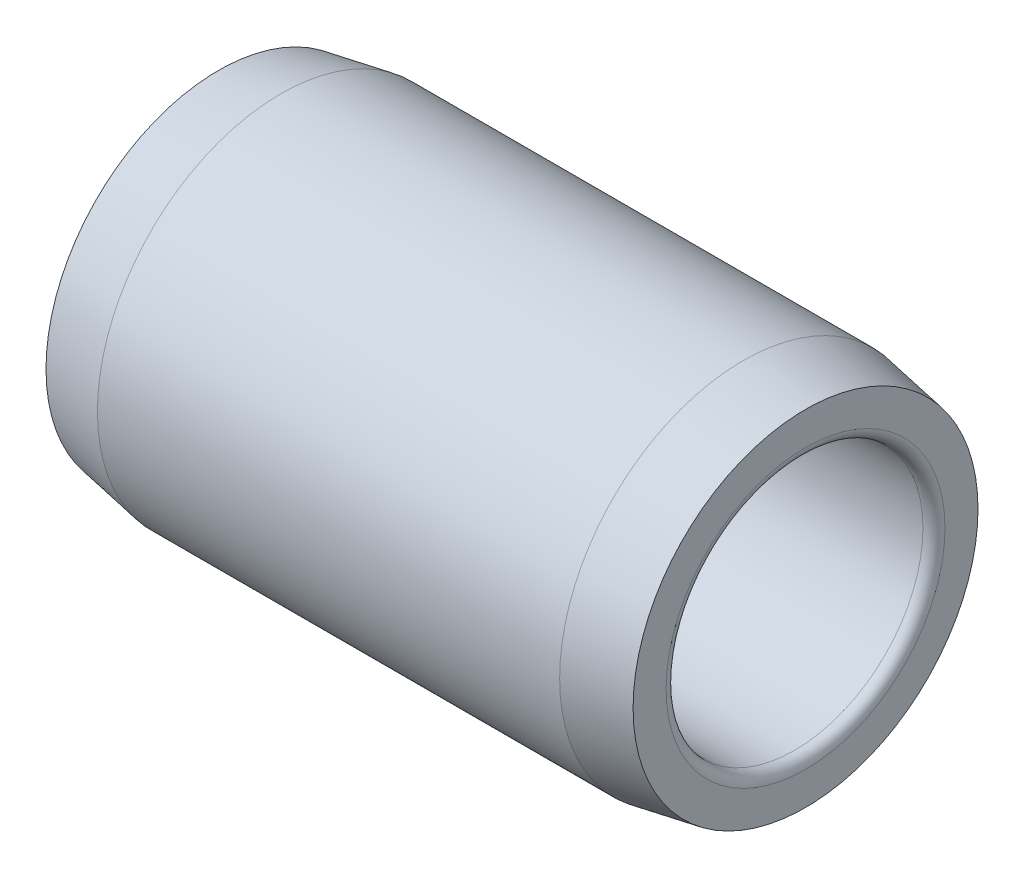
ISO-10303-21;
HEADER;
FILE_DESCRIPTION(('STEP AP214'),'2;1');
FILE_NAME('part.step','',(''),(''),'','','');
FILE_SCHEMA(('AUTOMOTIVE_DESIGN { 1 0 10303 214 1 1 1 1 }'));
ENDSEC;
DATA;
#1=APPLICATION_CONTEXT('core data for automotive mechanical design processes');
#2=APPLICATION_PROTOCOL_DEFINITION('international standard','automotive_design',2000,#1);
#3=PRODUCT_CONTEXT('',#1,'mechanical');
#4=PRODUCT('Part','Part','',(#3));
#5=PRODUCT_RELATED_PRODUCT_CATEGORY('part','',(#4));
#6=PRODUCT_DEFINITION_FORMATION('','',#4);
#7=PRODUCT_DEFINITION_CONTEXT('part definition',#1,'design');
#8=PRODUCT_DEFINITION('design','',#6,#7);
#9=PRODUCT_DEFINITION_SHAPE('','',#8);
#10=(LENGTH_UNIT() NAMED_UNIT(*) SI_UNIT(.MILLI.,.METRE.));
#11=(NAMED_UNIT(*) PLANE_ANGLE_UNIT() SI_UNIT($,.RADIAN.));
#12=(NAMED_UNIT(*) SI_UNIT($,.STERADIAN.) SOLID_ANGLE_UNIT());
#13=UNCERTAINTY_MEASURE_WITH_UNIT(LENGTH_MEASURE(1.E-05),#10,'distance_accuracy_value','');
#14=(GEOMETRIC_REPRESENTATION_CONTEXT(3) GLOBAL_UNCERTAINTY_ASSIGNED_CONTEXT((#13)) GLOBAL_UNIT_ASSIGNED_CONTEXT((#10,
#11,#12)) REPRESENTATION_CONTEXT('',''));
#15=CARTESIAN_POINT('',(0.,0.,0.));
#16=DIRECTION('',(0.,0.,1.));
#17=DIRECTION('',(1.,0.,0.));
#18=AXIS2_PLACEMENT_3D('',#15,#16,#17);
#19=CARTESIAN_POINT('',(0.,-4.69999977247635,-4.70000000000001));
#20=DIRECTION('',(-1.,0.,0.));
#21=DIRECTION('',(0.,0.,1.));
#22=AXIS2_PLACEMENT_3D('',#19,#20,#21);
#23=PLANE('',#22);
#24=CARTESIAN_POINT('',(0.,0.,0.));
#25=DIRECTION('',(-1.,0.,0.));
#26=DIRECTION('',(0.,0.,-1.));
#27=AXIS2_PLACEMENT_3D('',#24,#25,#26);
#28=CIRCLE('',#27,4.7);
#29=CARTESIAN_POINT('',(0.,0.,-4.7));
#30=VERTEX_POINT('',#29);
#31=EDGE_CURVE('E44',#30,#30,#28,.F.);
#32=ORIENTED_EDGE('',*,*,#31,.F.);
#33=EDGE_LOOP('',(#32));
#34=FACE_BOUND('',#33,.T.);
#35=CARTESIAN_POINT('',(0.,0.,0.));
#36=DIRECTION('',(1.,0.,0.));
#37=DIRECTION('',(0.,-1.42053919037127E-07,0.99999999999999));
#38=AXIS2_PLACEMENT_3D('',#35,#36,#37);
#39=CIRCLE('',#38,3.79999999999994);
#40=CARTESIAN_POINT('',(0.,-5.39804892341074E-07,3.7999999999999));
#41=VERTEX_POINT('',#40);
#42=EDGE_CURVE('E41',#41,#41,#39,.T.);
#43=ORIENTED_EDGE('',*,*,#42,.T.);
#44=EDGE_LOOP('',(#43));
#45=FACE_BOUND('',#44,.T.);
#46=ADVANCED_FACE('F15',(#34,#45),#23,.T.);
#47=CARTESIAN_POINT('',(16.,-4.6999997723461,4.70000036070561));
#48=DIRECTION('',(1.,0.,0.));
#49=DIRECTION('',(0.,0.,-1.));
#50=AXIS2_PLACEMENT_3D('',#47,#48,#49);
#51=PLANE('',#50);
#52=CARTESIAN_POINT('',(16.,0.,0.));
#53=DIRECTION('',(1.,0.,0.));
#54=DIRECTION('',(0.,-1.42006259233932E-07,0.99999999999999));
#55=AXIS2_PLACEMENT_3D('',#52,#53,#54);
#56=CIRCLE('',#55,4.7);
#57=CARTESIAN_POINT('',(16.,-6.67429418399482E-07,4.69999999999995));
#58=VERTEX_POINT('',#57);
#59=EDGE_CURVE('E38',#58,#58,#56,.T.);
#60=ORIENTED_EDGE('',*,*,#59,.T.);
#61=EDGE_LOOP('',(#60));
#62=FACE_BOUND('',#61,.T.);
#63=CARTESIAN_POINT('',(16.,0.,0.));
#64=DIRECTION('',(-1.,0.,0.));
#65=DIRECTION('',(0.,0.,-1.));
#66=AXIS2_PLACEMENT_3D('',#63,#64,#65);
#67=CIRCLE('',#66,3.8);
#68=CARTESIAN_POINT('',(16.,0.,-3.8));
#69=VERTEX_POINT('',#68);
#70=EDGE_CURVE('E35',#69,#69,#67,.F.);
#71=ORIENTED_EDGE('',*,*,#70,.F.);
#72=EDGE_LOOP('',(#71));
#73=FACE_BOUND('',#72,.T.);
#74=ADVANCED_FACE('F52',(#62,#73),#51,.T.);
#75=CARTESIAN_POINT('',(0.299999999999939,0.,0.));
#76=DIRECTION('',(1.,0.,0.));
#77=DIRECTION('',(0.,0.,1.));
#78=AXIS2_PLACEMENT_3D('',#75,#76,#77);
#79=TOROIDAL_SURFACE('',#78,3.79999999999994,0.299999999999939);
#80=CARTESIAN_POINT('',(0.3,0.,0.));
#81=DIRECTION('',(1.,0.,0.));
#82=DIRECTION('',(0.,0.,1.));
#83=AXIS2_PLACEMENT_3D('',#80,#81,#82);
#84=CIRCLE('',#83,3.5);
#85=CARTESIAN_POINT('',(0.3,0.,3.5));
#86=VERTEX_POINT('',#85);
#87=EDGE_CURVE('E30',#86,#86,#84,.T.);
#88=ORIENTED_EDGE('',*,*,#87,.T.);
#89=EDGE_LOOP('',(#88));
#90=FACE_BOUND('',#89,.T.);
#91=ORIENTED_EDGE('',*,*,#42,.F.);
#92=EDGE_LOOP('',(#91));
#93=FACE_BOUND('',#92,.T.);
#94=ADVANCED_FACE('F56',(#90,#93),#79,.T.);
#95=CARTESIAN_POINT('',(16.,0.,0.));
#96=DIRECTION('',(1.,0.,0.));
#97=DIRECTION('',(0.,0.,1.));
#98=AXIS2_PLACEMENT_3D('',#95,#96,#97);
#99=CYLINDRICAL_SURFACE('',#98,3.5);
#100=CARTESIAN_POINT('',(15.7,0.,0.));
#101=DIRECTION('',(1.,0.,0.));
#102=DIRECTION('',(0.,0.,1.));
#103=AXIS2_PLACEMENT_3D('',#100,#101,#102);
#104=CIRCLE('',#103,3.5);
#105=CARTESIAN_POINT('',(15.7,0.,3.5));
#106=VERTEX_POINT('',#105);
#107=EDGE_CURVE('E26',#106,#106,#104,.T.);
#108=ORIENTED_EDGE('',*,*,#107,.T.);
#109=EDGE_LOOP('',(#108));
#110=FACE_BOUND('',#109,.T.);
#111=ORIENTED_EDGE('',*,*,#87,.F.);
#112=EDGE_LOOP('',(#111));
#113=FACE_BOUND('',#112,.T.);
#114=ADVANCED_FACE('F58',(#110,#113),#99,.F.);
#115=CARTESIAN_POINT('',(15.7,0.,0.));
#116=DIRECTION('',(1.,0.,0.));
#117=DIRECTION('',(0.,0.,1.));
#118=AXIS2_PLACEMENT_3D('',#115,#116,#117);
#119=TOROIDAL_SURFACE('',#118,3.79999999999988,0.299999999999879);
#120=ORIENTED_EDGE('',*,*,#70,.T.);
#121=EDGE_LOOP('',(#120));
#122=FACE_BOUND('',#121,.T.);
#123=ORIENTED_EDGE('',*,*,#107,.F.);
#124=EDGE_LOOP('',(#123));
#125=FACE_BOUND('',#124,.T.);
#126=ADVANCED_FACE('F66',(#122,#125),#119,.T.);
#127=CARTESIAN_POINT('',(14.298615454115,0.,0.));
#128=DIRECTION('',(-1.,0.,0.));
#129=DIRECTION('',(0.,0.,-1.));
#130=AXIS2_PLACEMENT_3D('',#127,#128,#129);
#131=CONICAL_SURFACE('',#130,5.,0.174532925199462);
#132=ORIENTED_EDGE('',*,*,#59,.F.);
#133=EDGE_LOOP('',(#132));
#134=FACE_BOUND('',#133,.T.);
#135=CARTESIAN_POINT('',(14.298615454115,0.,0.));
#136=DIRECTION('',(1.,0.,0.));
#137=DIRECTION('',(0.,0.,1.));
#138=AXIS2_PLACEMENT_3D('',#135,#136,#137);
#139=CIRCLE('',#138,5.);
#140=CARTESIAN_POINT('',(14.298615454115,0.,5.));
#141=VERTEX_POINT('',#140);
#142=EDGE_CURVE('E22',#141,#141,#139,.T.);
#143=ORIENTED_EDGE('',*,*,#142,.T.);
#144=EDGE_LOOP('',(#143));
#145=FACE_BOUND('',#144,.T.);
#146=ADVANCED_FACE('F74',(#134,#145),#131,.T.);
#147=CARTESIAN_POINT('',(16.,0.,0.));
#148=DIRECTION('',(1.,0.,0.));
#149=DIRECTION('',(0.,0.,1.));
#150=AXIS2_PLACEMENT_3D('',#147,#148,#149);
#151=CYLINDRICAL_SURFACE('',#150,5.);
#152=CARTESIAN_POINT('',(1.7013845458853,0.,0.));
#153=DIRECTION('',(1.,0.,0.));
#154=DIRECTION('',(0.,0.,1.));
#155=AXIS2_PLACEMENT_3D('',#152,#153,#154);
#156=CIRCLE('',#155,5.);
#157=CARTESIAN_POINT('',(1.7013845458853,0.,5.));
#158=VERTEX_POINT('',#157);
#159=EDGE_CURVE('E10',#158,#158,#156,.T.);
#160=ORIENTED_EDGE('',*,*,#159,.T.);
#161=EDGE_LOOP('',(#160));
#162=FACE_BOUND('',#161,.T.);
#163=ORIENTED_EDGE('',*,*,#142,.F.);
#164=EDGE_LOOP('',(#163));
#165=FACE_BOUND('',#164,.T.);
#166=ADVANCED_FACE('F77',(#162,#165),#151,.T.);
#167=CARTESIAN_POINT('',(1.7013845458853,0.,0.));
#168=DIRECTION('',(1.,0.,0.));
#169=DIRECTION('',(0.,0.,1.));
#170=AXIS2_PLACEMENT_3D('',#167,#168,#169);
#171=CONICAL_SURFACE('',#170,5.,0.174532925199433);
#172=ORIENTED_EDGE('',*,*,#31,.T.);
#173=EDGE_LOOP('',(#172));
#174=FACE_BOUND('',#173,.T.);
#175=ORIENTED_EDGE('',*,*,#159,.F.);
#176=EDGE_LOOP('',(#175));
#177=FACE_BOUND('',#176,.T.);
#178=ADVANCED_FACE('F17',(#174,#177),#171,.T.);
#179=CLOSED_SHELL('',(#46,#74,#94,#114,#126,#146,#166,#178));
#180=MANIFOLD_SOLID_BREP('B1',#179);
#181=ADVANCED_BREP_SHAPE_REPRESENTATION('',(#18,#180),#14);
#182=SHAPE_DEFINITION_REPRESENTATION(#9,#181);
ENDSEC;
END-ISO-10303-21;
